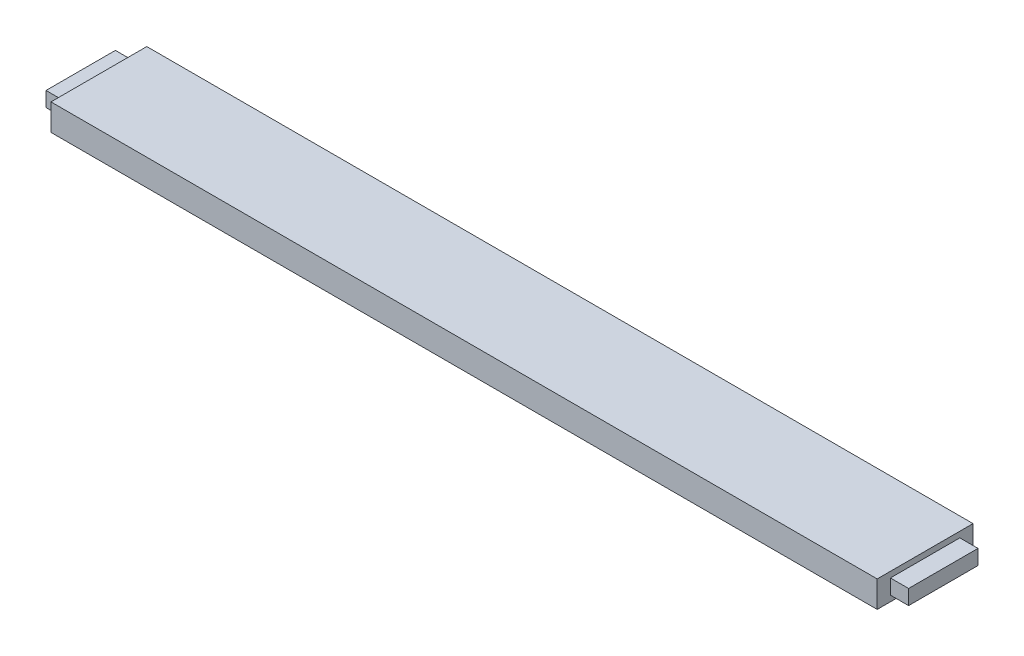
ISO-10303-21;
HEADER;
FILE_DESCRIPTION(('STEP AP214'),'2;1');
FILE_NAME('part.step','',(''),(''),'','','');
FILE_SCHEMA(('AUTOMOTIVE_DESIGN { 1 0 10303 214 1 1 1 1 }'));
ENDSEC;
DATA;
#1=APPLICATION_CONTEXT('core data for automotive mechanical design processes');
#2=APPLICATION_PROTOCOL_DEFINITION('international standard','automotive_design',2000,#1);
#3=PRODUCT_CONTEXT('',#1,'mechanical');
#4=PRODUCT('Part','Part','',(#3));
#5=PRODUCT_RELATED_PRODUCT_CATEGORY('part','',(#4));
#6=PRODUCT_DEFINITION_FORMATION('','',#4);
#7=PRODUCT_DEFINITION_CONTEXT('part definition',#1,'design');
#8=PRODUCT_DEFINITION('design','',#6,#7);
#9=PRODUCT_DEFINITION_SHAPE('','',#8);
#10=(LENGTH_UNIT() NAMED_UNIT(*) SI_UNIT(.MILLI.,.METRE.));
#11=(NAMED_UNIT(*) PLANE_ANGLE_UNIT() SI_UNIT($,.RADIAN.));
#12=(NAMED_UNIT(*) SI_UNIT($,.STERADIAN.) SOLID_ANGLE_UNIT());
#13=UNCERTAINTY_MEASURE_WITH_UNIT(LENGTH_MEASURE(1.E-05),#10,'distance_accuracy_value','');
#14=(GEOMETRIC_REPRESENTATION_CONTEXT(3) GLOBAL_UNCERTAINTY_ASSIGNED_CONTEXT((#13)) GLOBAL_UNIT_ASSIGNED_CONTEXT((#10,
#11,#12)) REPRESENTATION_CONTEXT('',''));
#15=CARTESIAN_POINT('',(0.,0.,0.));
#16=DIRECTION('',(0.,0.,1.));
#17=DIRECTION('',(1.,0.,0.));
#18=AXIS2_PLACEMENT_3D('',#15,#16,#17);
#19=CARTESIAN_POINT('',(-125.,8.,14.4984944243489));
#20=DIRECTION('',(1.,0.,0.));
#21=DIRECTION('',(0.,0.,-1.));
#22=AXIS2_PLACEMENT_3D('',#19,#20,#21);
#23=PLANE('',#22);
#24=DIRECTION('',(0.,0.,1.));
#25=VECTOR('',#24,1.);
#26=CARTESIAN_POINT('',(-125.,0.,14.4984944243489));
#27=LINE('',#26,#25);
#28=CARTESIAN_POINT('',(-125.,0.,-14.4984944243489));
#29=VERTEX_POINT('',#28);
#30=CARTESIAN_POINT('',(-125.,0.,14.4984944243489));
#31=VERTEX_POINT('',#30);
#32=EDGE_CURVE('E199',#29,#31,#27,.T.);
#33=ORIENTED_EDGE('',*,*,#32,.T.);
#34=DIRECTION('',(0.,-1.,0.));
#35=VECTOR('',#34,1.);
#36=CARTESIAN_POINT('',(-125.,8.,14.4984944243489));
#37=LINE('',#36,#35);
#38=CARTESIAN_POINT('',(-125.,8.,14.4984944243489));
#39=VERTEX_POINT('',#38);
#40=EDGE_CURVE('E204',#39,#31,#37,.T.);
#41=ORIENTED_EDGE('',*,*,#40,.F.);
#42=DIRECTION('',(0.,0.,1.));
#43=VECTOR('',#42,1.);
#44=CARTESIAN_POINT('',(-125.,8.,14.4984944243489));
#45=LINE('',#44,#43);
#46=CARTESIAN_POINT('',(-125.,8.,-14.4984944243489));
#47=VERTEX_POINT('',#46);
#48=EDGE_CURVE('E190',#47,#39,#45,.T.);
#49=ORIENTED_EDGE('',*,*,#48,.F.);
#50=DIRECTION('',(0.,-1.,0.));
#51=VECTOR('',#50,1.);
#52=CARTESIAN_POINT('',(-125.,8.,-14.4984944243489));
#53=LINE('',#52,#51);
#54=EDGE_CURVE('E43',#47,#29,#53,.T.);
#55=ORIENTED_EDGE('',*,*,#54,.T.);
#56=EDGE_LOOP('',(#33,#41,#49,#55));
#57=FACE_BOUND('',#56,.T.);
#58=DIRECTION('',(0.,-1.,0.));
#59=VECTOR('',#58,1.);
#60=CARTESIAN_POINT('',(-125.,1.75197211299593,-10.4992465813609));
#61=LINE('',#60,#59);
#62=CARTESIAN_POINT('',(-125.,6.24802788700407,-10.4992465813609));
#63=VERTEX_POINT('',#62);
#64=CARTESIAN_POINT('',(-125.,1.75197211299593,-10.4992465813609));
#65=VERTEX_POINT('',#64);
#66=EDGE_CURVE('E144',#63,#65,#61,.T.);
#67=ORIENTED_EDGE('',*,*,#66,.F.);
#68=DIRECTION('',(0.,0.,-1.));
#69=VECTOR('',#68,1.);
#70=CARTESIAN_POINT('',(-125.,6.24802788700407,10.4992465813609));
#71=LINE('',#70,#69);
#72=CARTESIAN_POINT('',(-125.,6.24802788700407,10.4992465813609));
#73=VERTEX_POINT('',#72);
#74=EDGE_CURVE('E141',#73,#63,#71,.T.);
#75=ORIENTED_EDGE('',*,*,#74,.F.);
#76=DIRECTION('',(0.,1.,0.));
#77=VECTOR('',#76,1.);
#78=CARTESIAN_POINT('',(-125.,1.75197211299593,10.4992465813609));
#79=LINE('',#78,#77);
#80=CARTESIAN_POINT('',(-125.,1.75197211299593,10.4992465813609));
#81=VERTEX_POINT('',#80);
#82=EDGE_CURVE('E55',#81,#73,#79,.T.);
#83=ORIENTED_EDGE('',*,*,#82,.F.);
#84=DIRECTION('',(0.,0.,1.));
#85=VECTOR('',#84,1.);
#86=CARTESIAN_POINT('',(-125.,1.75197211299593,10.4992465813609));
#87=LINE('',#86,#85);
#88=EDGE_CURVE('E50',#65,#81,#87,.T.);
#89=ORIENTED_EDGE('',*,*,#88,.F.);
#90=EDGE_LOOP('',(#67,#75,#83,#89));
#91=FACE_BOUND('',#90,.T.);
#92=ADVANCED_FACE('F35',(#57,#91),#23,.F.);
#93=CARTESIAN_POINT('',(125.,8.,14.4984944243489));
#94=DIRECTION('',(-1.,0.,0.));
#95=DIRECTION('',(0.,0.,1.));
#96=AXIS2_PLACEMENT_3D('',#93,#94,#95);
#97=PLANE('',#96);
#98=DIRECTION('',(0.,0.,-1.));
#99=VECTOR('',#98,1.);
#100=CARTESIAN_POINT('',(125.,0.,14.4984944243489));
#101=LINE('',#100,#99);
#102=CARTESIAN_POINT('',(125.,0.,14.4984944243489));
#103=VERTEX_POINT('',#102);
#104=CARTESIAN_POINT('',(125.,0.,-14.4984944243489));
#105=VERTEX_POINT('',#104);
#106=EDGE_CURVE('E183',#103,#105,#101,.T.);
#107=ORIENTED_EDGE('',*,*,#106,.T.);
#108=DIRECTION('',(0.,-1.,0.));
#109=VECTOR('',#108,1.);
#110=CARTESIAN_POINT('',(125.,8.,-14.4984944243489));
#111=LINE('',#110,#109);
#112=CARTESIAN_POINT('',(125.,8.,-14.4984944243489));
#113=VERTEX_POINT('',#112);
#114=EDGE_CURVE('E11',#113,#105,#111,.T.);
#115=ORIENTED_EDGE('',*,*,#114,.F.);
#116=DIRECTION('',(0.,0.,-1.));
#117=VECTOR('',#116,1.);
#118=CARTESIAN_POINT('',(125.,8.,14.4984944243489));
#119=LINE('',#118,#117);
#120=CARTESIAN_POINT('',(125.,8.,14.4984944243489));
#121=VERTEX_POINT('',#120);
#122=EDGE_CURVE('E184',#121,#113,#119,.T.);
#123=ORIENTED_EDGE('',*,*,#122,.F.);
#124=DIRECTION('',(0.,-1.,0.));
#125=VECTOR('',#124,1.);
#126=CARTESIAN_POINT('',(125.,8.,14.4984944243489));
#127=LINE('',#126,#125);
#128=EDGE_CURVE('E194',#121,#103,#127,.T.);
#129=ORIENTED_EDGE('',*,*,#128,.T.);
#130=EDGE_LOOP('',(#107,#115,#123,#129));
#131=FACE_BOUND('',#130,.T.);
#132=DIRECTION('',(0.,1.,0.));
#133=VECTOR('',#132,1.);
#134=CARTESIAN_POINT('',(125.,6.25056253538236,-10.5009141589036));
#135=LINE('',#134,#133);
#136=CARTESIAN_POINT('',(125.,1.74943746461764,-10.5009141589036));
#137=VERTEX_POINT('',#136);
#138=CARTESIAN_POINT('',(125.,6.25056253538236,-10.5009141589036));
#139=VERTEX_POINT('',#138);
#140=EDGE_CURVE('E145',#137,#139,#135,.T.);
#141=ORIENTED_EDGE('',*,*,#140,.F.);
#142=DIRECTION('',(0.,0.,-1.));
#143=VECTOR('',#142,1.);
#144=CARTESIAN_POINT('',(125.,1.74943746461764,10.5009141589036));
#145=LINE('',#144,#143);
#146=CARTESIAN_POINT('',(125.,1.74943746461764,10.5009141589036));
#147=VERTEX_POINT('',#146);
#148=EDGE_CURVE('E158',#147,#137,#145,.T.);
#149=ORIENTED_EDGE('',*,*,#148,.F.);
#150=DIRECTION('',(0.,-1.,0.));
#151=VECTOR('',#150,1.);
#152=CARTESIAN_POINT('',(125.,6.25056253538236,10.5009141589036));
#153=LINE('',#152,#151);
#154=CARTESIAN_POINT('',(125.,6.25056253538236,10.5009141589036));
#155=VERTEX_POINT('',#154);
#156=EDGE_CURVE('E167',#155,#147,#153,.T.);
#157=ORIENTED_EDGE('',*,*,#156,.F.);
#158=DIRECTION('',(0.,0.,1.));
#159=VECTOR('',#158,1.);
#160=CARTESIAN_POINT('',(125.,6.25056253538236,10.5009141589036));
#161=LINE('',#160,#159);
#162=EDGE_CURVE('E148',#139,#155,#161,.T.);
#163=ORIENTED_EDGE('',*,*,#162,.F.);
#164=EDGE_LOOP('',(#141,#149,#157,#163));
#165=FACE_BOUND('',#164,.T.);
#166=ADVANCED_FACE('F37',(#131,#165),#97,.F.);
#167=CARTESIAN_POINT('',(-125.,8.,-14.4984944243489));
#168=DIRECTION('',(0.,0.,1.));
#169=DIRECTION('',(1.,0.,0.));
#170=AXIS2_PLACEMENT_3D('',#167,#168,#169);
#171=PLANE('',#170);
#172=DIRECTION('',(-1.,0.,0.));
#173=VECTOR('',#172,1.);
#174=CARTESIAN_POINT('',(-125.,0.,-14.4984944243489));
#175=LINE('',#174,#173);
#176=EDGE_CURVE('E197',#105,#29,#175,.T.);
#177=ORIENTED_EDGE('',*,*,#176,.T.);
#178=ORIENTED_EDGE('',*,*,#54,.F.);
#179=DIRECTION('',(-1.,0.,0.));
#180=VECTOR('',#179,1.);
#181=CARTESIAN_POINT('',(-125.,8.,-14.4984944243489));
#182=LINE('',#181,#180);
#183=EDGE_CURVE('E187',#113,#47,#182,.T.);
#184=ORIENTED_EDGE('',*,*,#183,.F.);
#185=ORIENTED_EDGE('',*,*,#114,.T.);
#186=EDGE_LOOP('',(#177,#178,#184,#185));
#187=FACE_BOUND('',#186,.T.);
#188=ADVANCED_FACE('F227',(#187),#171,.F.);
#189=CARTESIAN_POINT('',(-125.,8.,14.4984944243489));
#190=DIRECTION('',(0.,0.,-1.));
#191=DIRECTION('',(-1.,0.,0.));
#192=AXIS2_PLACEMENT_3D('',#189,#190,#191);
#193=PLANE('',#192);
#194=DIRECTION('',(1.,0.,0.));
#195=VECTOR('',#194,1.);
#196=CARTESIAN_POINT('',(-125.,0.,14.4984944243489));
#197=LINE('',#196,#195);
#198=EDGE_CURVE('E188',#31,#103,#197,.T.);
#199=ORIENTED_EDGE('',*,*,#198,.T.);
#200=ORIENTED_EDGE('',*,*,#128,.F.);
#201=DIRECTION('',(1.,0.,0.));
#202=VECTOR('',#201,1.);
#203=CARTESIAN_POINT('',(-125.,8.,14.4984944243489));
#204=LINE('',#203,#202);
#205=EDGE_CURVE('E192',#39,#121,#204,.T.);
#206=ORIENTED_EDGE('',*,*,#205,.F.);
#207=ORIENTED_EDGE('',*,*,#40,.T.);
#208=EDGE_LOOP('',(#199,#200,#206,#207));
#209=FACE_BOUND('',#208,.T.);
#210=ADVANCED_FACE('F219',(#209),#193,.F.);
#211=CARTESIAN_POINT('',(0.,8.,0.));
#212=DIRECTION('',(0.,-1.,0.));
#213=DIRECTION('',(0.,0.,-1.));
#214=AXIS2_PLACEMENT_3D('',#211,#212,#213);
#215=PLANE('',#214);
#216=ORIENTED_EDGE('',*,*,#122,.T.);
#217=ORIENTED_EDGE('',*,*,#183,.T.);
#218=ORIENTED_EDGE('',*,*,#48,.T.);
#219=ORIENTED_EDGE('',*,*,#205,.T.);
#220=EDGE_LOOP('',(#216,#217,#218,#219));
#221=FACE_BOUND('',#220,.T.);
#222=ADVANCED_FACE('F226',(#221),#215,.F.);
#223=CARTESIAN_POINT('',(0.,0.,0.));
#224=DIRECTION('',(0.,-1.,0.));
#225=DIRECTION('',(0.,0.,-1.));
#226=AXIS2_PLACEMENT_3D('',#223,#224,#225);
#227=PLANE('',#226);
#228=ORIENTED_EDGE('',*,*,#106,.F.);
#229=ORIENTED_EDGE('',*,*,#198,.F.);
#230=ORIENTED_EDGE('',*,*,#32,.F.);
#231=ORIENTED_EDGE('',*,*,#176,.F.);
#232=EDGE_LOOP('',(#228,#229,#230,#231));
#233=FACE_BOUND('',#232,.T.);
#234=ADVANCED_FACE('F216',(#233),#227,.T.);
#235=CARTESIAN_POINT('',(130.5,6.25056253538236,-10.5009141589036));
#236=DIRECTION('',(0.,0.,1.));
#237=DIRECTION('',(1.,0.,0.));
#238=AXIS2_PLACEMENT_3D('',#235,#236,#237);
#239=PLANE('',#238);
#240=ORIENTED_EDGE('',*,*,#140,.T.);
#241=DIRECTION('',(-1.,0.,0.));
#242=VECTOR('',#241,1.);
#243=CARTESIAN_POINT('',(130.5,6.25056253538236,-10.5009141589036));
#244=LINE('',#243,#242);
#245=CARTESIAN_POINT('',(130.5,6.25056253538236,-10.5009141589036));
#246=VERTEX_POINT('',#245);
#247=EDGE_CURVE('E180',#246,#139,#244,.T.);
#248=ORIENTED_EDGE('',*,*,#247,.F.);
#249=DIRECTION('',(0.,1.,0.));
#250=VECTOR('',#249,1.);
#251=CARTESIAN_POINT('',(130.5,6.25056253538236,-10.5009141589036));
#252=LINE('',#251,#250);
#253=CARTESIAN_POINT('',(130.5,1.74943746461764,-10.5009141589036));
#254=VERTEX_POINT('',#253);
#255=EDGE_CURVE('E154',#254,#246,#252,.T.);
#256=ORIENTED_EDGE('',*,*,#255,.F.);
#257=DIRECTION('',(-1.,0.,0.));
#258=VECTOR('',#257,1.);
#259=CARTESIAN_POINT('',(130.5,1.74943746461764,-10.5009141589036));
#260=LINE('',#259,#258);
#261=EDGE_CURVE('E163',#254,#137,#260,.T.);
#262=ORIENTED_EDGE('',*,*,#261,.T.);
#263=EDGE_LOOP('',(#240,#248,#256,#262));
#264=FACE_BOUND('',#263,.T.);
#265=ADVANCED_FACE('F241',(#264),#239,.F.);
#266=CARTESIAN_POINT('',(130.5,6.25056253538236,10.5009141589036));
#267=DIRECTION('',(0.,-1.,0.));
#268=DIRECTION('',(0.,0.,-1.));
#269=AXIS2_PLACEMENT_3D('',#266,#267,#268);
#270=PLANE('',#269);
#271=ORIENTED_EDGE('',*,*,#162,.T.);
#272=DIRECTION('',(-1.,0.,0.));
#273=VECTOR('',#272,1.);
#274=CARTESIAN_POINT('',(130.5,6.25056253538236,10.5009141589036));
#275=LINE('',#274,#273);
#276=CARTESIAN_POINT('',(130.5,6.25056253538236,10.5009141589036));
#277=VERTEX_POINT('',#276);
#278=EDGE_CURVE('E177',#277,#155,#275,.T.);
#279=ORIENTED_EDGE('',*,*,#278,.F.);
#280=DIRECTION('',(0.,0.,1.));
#281=VECTOR('',#280,1.);
#282=CARTESIAN_POINT('',(130.5,6.25056253538236,10.5009141589036));
#283=LINE('',#282,#281);
#284=EDGE_CURVE('E157',#246,#277,#283,.T.);
#285=ORIENTED_EDGE('',*,*,#284,.F.);
#286=ORIENTED_EDGE('',*,*,#247,.T.);
#287=EDGE_LOOP('',(#271,#279,#285,#286));
#288=FACE_BOUND('',#287,.T.);
#289=ADVANCED_FACE('F246',(#288),#270,.F.);
#290=CARTESIAN_POINT('',(130.5,6.25056253538236,10.5009141589036));
#291=DIRECTION('',(0.,0.,-1.));
#292=DIRECTION('',(-1.,0.,0.));
#293=AXIS2_PLACEMENT_3D('',#290,#291,#292);
#294=PLANE('',#293);
#295=ORIENTED_EDGE('',*,*,#156,.T.);
#296=DIRECTION('',(-1.,0.,0.));
#297=VECTOR('',#296,1.);
#298=CARTESIAN_POINT('',(130.5,1.74943746461764,10.5009141589036));
#299=LINE('',#298,#297);
#300=CARTESIAN_POINT('',(130.5,1.74943746461764,10.5009141589036));
#301=VERTEX_POINT('',#300);
#302=EDGE_CURVE('E174',#301,#147,#299,.T.);
#303=ORIENTED_EDGE('',*,*,#302,.F.);
#304=DIRECTION('',(0.,-1.,0.));
#305=VECTOR('',#304,1.);
#306=CARTESIAN_POINT('',(130.5,6.25056253538236,10.5009141589036));
#307=LINE('',#306,#305);
#308=EDGE_CURVE('E160',#277,#301,#307,.T.);
#309=ORIENTED_EDGE('',*,*,#308,.F.);
#310=ORIENTED_EDGE('',*,*,#278,.T.);
#311=EDGE_LOOP('',(#295,#303,#309,#310));
#312=FACE_BOUND('',#311,.T.);
#313=ADVANCED_FACE('F250',(#312),#294,.F.);
#314=CARTESIAN_POINT('',(130.5,1.74943746461764,10.5009141589036));
#315=DIRECTION('',(0.,1.,0.));
#316=DIRECTION('',(0.,0.,1.));
#317=AXIS2_PLACEMENT_3D('',#314,#315,#316);
#318=PLANE('',#317);
#319=ORIENTED_EDGE('',*,*,#148,.T.);
#320=ORIENTED_EDGE('',*,*,#261,.F.);
#321=DIRECTION('',(0.,0.,-1.));
#322=VECTOR('',#321,1.);
#323=CARTESIAN_POINT('',(130.5,1.74943746461764,10.5009141589036));
#324=LINE('',#323,#322);
#325=EDGE_CURVE('E162',#301,#254,#324,.T.);
#326=ORIENTED_EDGE('',*,*,#325,.F.);
#327=ORIENTED_EDGE('',*,*,#302,.T.);
#328=EDGE_LOOP('',(#319,#320,#326,#327));
#329=FACE_BOUND('',#328,.T.);
#330=ADVANCED_FACE('F254',(#329),#318,.F.);
#331=CARTESIAN_POINT('',(130.5,0.,0.));
#332=DIRECTION('',(1.,0.,0.));
#333=DIRECTION('',(0.,0.,-1.));
#334=AXIS2_PLACEMENT_3D('',#331,#332,#333);
#335=PLANE('',#334);
#336=ORIENTED_EDGE('',*,*,#255,.T.);
#337=ORIENTED_EDGE('',*,*,#284,.T.);
#338=ORIENTED_EDGE('',*,*,#308,.T.);
#339=ORIENTED_EDGE('',*,*,#325,.T.);
#340=EDGE_LOOP('',(#336,#337,#338,#339));
#341=FACE_BOUND('',#340,.T.);
#342=ADVANCED_FACE('F258',(#341),#335,.T.);
#343=CARTESIAN_POINT('',(-130.5,1.75197211299593,-10.4992465813609));
#344=DIRECTION('',(0.,0.,1.));
#345=DIRECTION('',(1.,0.,0.));
#346=AXIS2_PLACEMENT_3D('',#343,#344,#345);
#347=PLANE('',#346);
#348=ORIENTED_EDGE('',*,*,#66,.T.);
#349=DIRECTION('',(1.,0.,0.));
#350=VECTOR('',#349,1.);
#351=CARTESIAN_POINT('',(-130.5,1.75197211299593,-10.4992465813609));
#352=LINE('',#351,#350);
#353=CARTESIAN_POINT('',(-130.5,1.75197211299593,-10.4992465813609));
#354=VERTEX_POINT('',#353);
#355=EDGE_CURVE('E125',#354,#65,#352,.T.);
#356=ORIENTED_EDGE('',*,*,#355,.F.);
#357=DIRECTION('',(0.,-1.,0.));
#358=VECTOR('',#357,1.);
#359=CARTESIAN_POINT('',(-130.5,1.75197211299593,-10.4992465813609));
#360=LINE('',#359,#358);
#361=CARTESIAN_POINT('',(-130.5,6.24802788700407,-10.4992465813609));
#362=VERTEX_POINT('',#361);
#363=EDGE_CURVE('E132',#362,#354,#360,.T.);
#364=ORIENTED_EDGE('',*,*,#363,.F.);
#365=DIRECTION('',(1.,0.,0.));
#366=VECTOR('',#365,1.);
#367=CARTESIAN_POINT('',(-130.5,6.24802788700407,-10.4992465813609));
#368=LINE('',#367,#366);
#369=EDGE_CURVE('E370',#362,#63,#368,.T.);
#370=ORIENTED_EDGE('',*,*,#369,.T.);
#371=EDGE_LOOP('',(#348,#356,#364,#370));
#372=FACE_BOUND('',#371,.T.);
#373=ADVANCED_FACE('F143',(#372),#347,.F.);
#374=CARTESIAN_POINT('',(-130.5,1.75197211299593,10.4992465813609));
#375=DIRECTION('',(0.,1.,0.));
#376=DIRECTION('',(0.,0.,1.));
#377=AXIS2_PLACEMENT_3D('',#374,#375,#376);
#378=PLANE('',#377);
#379=ORIENTED_EDGE('',*,*,#88,.T.);
#380=DIRECTION('',(1.,0.,0.));
#381=VECTOR('',#380,1.);
#382=CARTESIAN_POINT('',(-130.5,1.75197211299593,10.4992465813609));
#383=LINE('',#382,#381);
#384=CARTESIAN_POINT('',(-130.5,1.75197211299593,10.4992465813609));
#385=VERTEX_POINT('',#384);
#386=EDGE_CURVE('E128',#385,#81,#383,.T.);
#387=ORIENTED_EDGE('',*,*,#386,.F.);
#388=DIRECTION('',(0.,0.,1.));
#389=VECTOR('',#388,1.);
#390=CARTESIAN_POINT('',(-130.5,1.75197211299593,10.4992465813609));
#391=LINE('',#390,#389);
#392=EDGE_CURVE('E121',#354,#385,#391,.T.);
#393=ORIENTED_EDGE('',*,*,#392,.F.);
#394=ORIENTED_EDGE('',*,*,#355,.T.);
#395=EDGE_LOOP('',(#379,#387,#393,#394));
#396=FACE_BOUND('',#395,.T.);
#397=ADVANCED_FACE('F123',(#396),#378,.F.);
#398=CARTESIAN_POINT('',(-130.5,1.75197211299593,10.4992465813609));
#399=DIRECTION('',(0.,0.,-1.));
#400=DIRECTION('',(-1.,0.,0.));
#401=AXIS2_PLACEMENT_3D('',#398,#399,#400);
#402=PLANE('',#401);
#403=ORIENTED_EDGE('',*,*,#82,.T.);
#404=DIRECTION('',(1.,0.,0.));
#405=VECTOR('',#404,1.);
#406=CARTESIAN_POINT('',(-130.5,6.24802788700407,10.4992465813609));
#407=LINE('',#406,#405);
#408=CARTESIAN_POINT('',(-130.5,6.24802788700407,10.4992465813609));
#409=VERTEX_POINT('',#408);
#410=EDGE_CURVE('E150',#409,#73,#407,.T.);
#411=ORIENTED_EDGE('',*,*,#410,.F.);
#412=DIRECTION('',(0.,1.,0.));
#413=VECTOR('',#412,1.);
#414=CARTESIAN_POINT('',(-130.5,1.75197211299593,10.4992465813609));
#415=LINE('',#414,#413);
#416=EDGE_CURVE('E131',#385,#409,#415,.T.);
#417=ORIENTED_EDGE('',*,*,#416,.F.);
#418=ORIENTED_EDGE('',*,*,#386,.T.);
#419=EDGE_LOOP('',(#403,#411,#417,#418));
#420=FACE_BOUND('',#419,.T.);
#421=ADVANCED_FACE('F267',(#420),#402,.F.);
#422=CARTESIAN_POINT('',(-130.5,6.24802788700407,10.4992465813609));
#423=DIRECTION('',(0.,-1.,0.));
#424=DIRECTION('',(0.,0.,-1.));
#425=AXIS2_PLACEMENT_3D('',#422,#423,#424);
#426=PLANE('',#425);
#427=ORIENTED_EDGE('',*,*,#74,.T.);
#428=ORIENTED_EDGE('',*,*,#369,.F.);
#429=DIRECTION('',(0.,0.,-1.));
#430=VECTOR('',#429,1.);
#431=CARTESIAN_POINT('',(-130.5,6.24802788700407,10.4992465813609));
#432=LINE('',#431,#430);
#433=EDGE_CURVE('E137',#409,#362,#432,.T.);
#434=ORIENTED_EDGE('',*,*,#433,.F.);
#435=ORIENTED_EDGE('',*,*,#410,.T.);
#436=EDGE_LOOP('',(#427,#428,#434,#435));
#437=FACE_BOUND('',#436,.T.);
#438=ADVANCED_FACE('F270',(#437),#426,.F.);
#439=CARTESIAN_POINT('',(-130.5,0.,0.));
#440=DIRECTION('',(-1.,0.,0.));
#441=DIRECTION('',(0.,0.,1.));
#442=AXIS2_PLACEMENT_3D('',#439,#440,#441);
#443=PLANE('',#442);
#444=ORIENTED_EDGE('',*,*,#363,.T.);
#445=ORIENTED_EDGE('',*,*,#392,.T.);
#446=ORIENTED_EDGE('',*,*,#416,.T.);
#447=ORIENTED_EDGE('',*,*,#433,.T.);
#448=EDGE_LOOP('',(#444,#445,#446,#447));
#449=FACE_BOUND('',#448,.T.);
#450=ADVANCED_FACE('F135',(#449),#443,.T.);
#451=CLOSED_SHELL('',(#92,#166,#188,#210,#222,#234,#265,#289,#313,#330,#342,#373,#397,#421,#438,#450));
#452=MANIFOLD_SOLID_BREP('B2',#451);
#453=ADVANCED_BREP_SHAPE_REPRESENTATION('',(#18,#452),#14);
#454=SHAPE_DEFINITION_REPRESENTATION(#9,#453);
ENDSEC;
END-ISO-10303-21;
